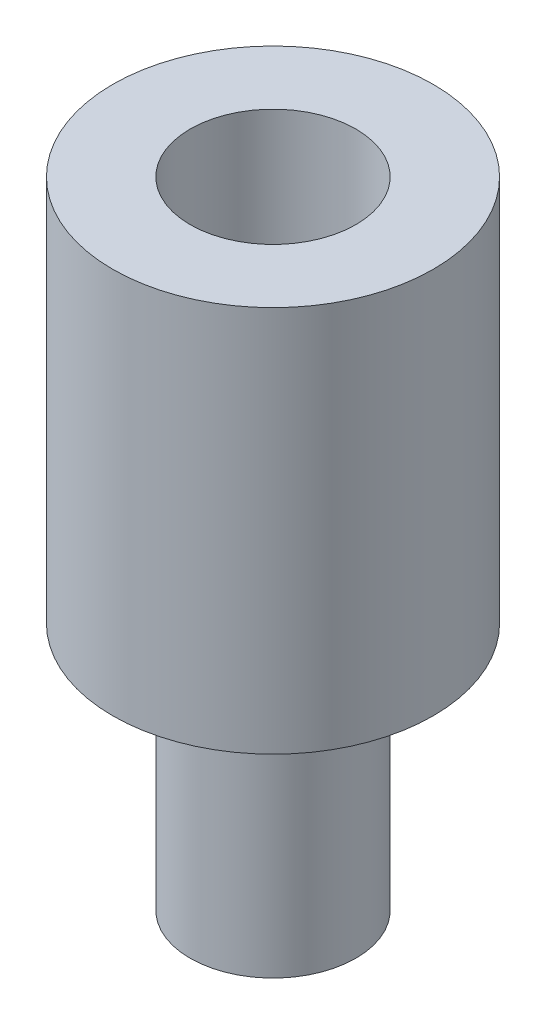
ISO-10303-21;
HEADER;
FILE_DESCRIPTION(('STEP AP214'),'2;1');
FILE_NAME('part.step','',(''),(''),'','','');
FILE_SCHEMA(('AUTOMOTIVE_DESIGN { 1 0 10303 214 1 1 1 1 }'));
ENDSEC;
DATA;
#1=APPLICATION_CONTEXT('core data for automotive mechanical design processes');
#2=APPLICATION_PROTOCOL_DEFINITION('international standard','automotive_design',2000,#1);
#3=PRODUCT_CONTEXT('',#1,'mechanical');
#4=PRODUCT('Part','Part','',(#3));
#5=PRODUCT_RELATED_PRODUCT_CATEGORY('part','',(#4));
#6=PRODUCT_DEFINITION_FORMATION('','',#4);
#7=PRODUCT_DEFINITION_CONTEXT('part definition',#1,'design');
#8=PRODUCT_DEFINITION('design','',#6,#7);
#9=PRODUCT_DEFINITION_SHAPE('','',#8);
#10=(LENGTH_UNIT() NAMED_UNIT(*) SI_UNIT(.MILLI.,.METRE.));
#11=(NAMED_UNIT(*) PLANE_ANGLE_UNIT() SI_UNIT($,.RADIAN.));
#12=(NAMED_UNIT(*) SI_UNIT($,.STERADIAN.) SOLID_ANGLE_UNIT());
#13=UNCERTAINTY_MEASURE_WITH_UNIT(LENGTH_MEASURE(1.E-05),#10,'distance_accuracy_value','');
#14=(GEOMETRIC_REPRESENTATION_CONTEXT(3) GLOBAL_UNCERTAINTY_ASSIGNED_CONTEXT((#13)) GLOBAL_UNIT_ASSIGNED_CONTEXT((#10,
#11,#12)) REPRESENTATION_CONTEXT('',''));
#15=CARTESIAN_POINT('',(0.,0.,0.));
#16=DIRECTION('',(0.,0.,1.));
#17=DIRECTION('',(1.,0.,0.));
#18=AXIS2_PLACEMENT_3D('',#15,#16,#17);
#19=CARTESIAN_POINT('',(0.,7.,0.));
#20=DIRECTION('',(0.,-1.,0.));
#21=DIRECTION('',(0.,0.,-1.));
#22=AXIS2_PLACEMENT_3D('',#19,#20,#21);
#23=CYLINDRICAL_SURFACE('',#22,2.9);
#24=CARTESIAN_POINT('',(0.,7.,0.));
#25=DIRECTION('',(0.,1.,0.));
#26=DIRECTION('',(0.,0.,1.));
#27=AXIS2_PLACEMENT_3D('',#24,#25,#26);
#28=CIRCLE('',#27,2.9);
#29=CARTESIAN_POINT('',(0.,7.,2.9));
#30=VERTEX_POINT('',#29);
#31=EDGE_CURVE('E40',#30,#30,#28,.T.);
#32=ORIENTED_EDGE('',*,*,#31,.F.);
#33=EDGE_LOOP('',(#32));
#34=FACE_BOUND('',#33,.T.);
#35=CARTESIAN_POINT('',(0.,0.,0.));
#36=DIRECTION('',(0.,1.,0.));
#37=DIRECTION('',(0.,0.,1.));
#38=AXIS2_PLACEMENT_3D('',#35,#36,#37);
#39=CIRCLE('',#38,2.9);
#40=CARTESIAN_POINT('',(0.,0.,2.9));
#41=VERTEX_POINT('',#40);
#42=EDGE_CURVE('E36',#41,#41,#39,.T.);
#43=ORIENTED_EDGE('',*,*,#42,.T.);
#44=EDGE_LOOP('',(#43));
#45=FACE_BOUND('',#44,.T.);
#46=ADVANCED_FACE('F33',(#34,#45),#23,.T.);
#47=CARTESIAN_POINT('',(0.,7.,0.));
#48=DIRECTION('',(0.,1.,0.));
#49=DIRECTION('',(0.,0.,1.));
#50=AXIS2_PLACEMENT_3D('',#47,#48,#49);
#51=PLANE('',#50);
#52=CARTESIAN_POINT('',(0.,7.,0.));
#53=DIRECTION('',(0.,1.,0.));
#54=DIRECTION('',(0.,0.,1.));
#55=AXIS2_PLACEMENT_3D('',#52,#53,#54);
#56=CIRCLE('',#55,1.5);
#57=CARTESIAN_POINT('',(0.,7.,1.5));
#58=VERTEX_POINT('',#57);
#59=EDGE_CURVE('E50',#58,#58,#56,.T.);
#60=ORIENTED_EDGE('',*,*,#59,.F.);
#61=EDGE_LOOP('',(#60));
#62=FACE_BOUND('',#61,.T.);
#63=ORIENTED_EDGE('',*,*,#31,.T.);
#64=EDGE_LOOP('',(#63));
#65=FACE_BOUND('',#64,.T.);
#66=ADVANCED_FACE('F65',(#62,#65),#51,.T.);
#67=CARTESIAN_POINT('',(0.,0.,0.));
#68=DIRECTION('',(0.,1.,0.));
#69=DIRECTION('',(0.,0.,1.));
#70=AXIS2_PLACEMENT_3D('',#67,#68,#69);
#71=PLANE('',#70);
#72=CARTESIAN_POINT('',(0.,0.,0.));
#73=DIRECTION('',(0.,-1.,0.));
#74=DIRECTION('',(0.,0.,-1.));
#75=AXIS2_PLACEMENT_3D('',#72,#73,#74);
#76=CIRCLE('',#75,1.5);
#77=CARTESIAN_POINT('',(0.,0.,-1.5));
#78=VERTEX_POINT('',#77);
#79=EDGE_CURVE('E10',#78,#78,#76,.T.);
#80=ORIENTED_EDGE('',*,*,#79,.F.);
#81=EDGE_LOOP('',(#80));
#82=FACE_BOUND('',#81,.T.);
#83=ORIENTED_EDGE('',*,*,#42,.F.);
#84=EDGE_LOOP('',(#83));
#85=FACE_BOUND('',#84,.T.);
#86=ADVANCED_FACE('F68',(#82,#85),#71,.F.);
#87=CARTESIAN_POINT('',(0.,-4.5,0.));
#88=DIRECTION('',(0.,1.,0.));
#89=DIRECTION('',(0.,0.,1.));
#90=AXIS2_PLACEMENT_3D('',#87,#88,#89);
#91=CYLINDRICAL_SURFACE('',#90,1.5);
#92=CARTESIAN_POINT('',(0.,-4.5,0.));
#93=DIRECTION('',(0.,-1.,0.));
#94=DIRECTION('',(0.,0.,-1.));
#95=AXIS2_PLACEMENT_3D('',#92,#93,#94);
#96=CIRCLE('',#95,1.5);
#97=CARTESIAN_POINT('',(0.,-4.5,-1.5));
#98=VERTEX_POINT('',#97);
#99=EDGE_CURVE('E46',#98,#98,#96,.T.);
#100=ORIENTED_EDGE('',*,*,#99,.F.);
#101=EDGE_LOOP('',(#100));
#102=FACE_BOUND('',#101,.T.);
#103=ORIENTED_EDGE('',*,*,#79,.T.);
#104=EDGE_LOOP('',(#103));
#105=FACE_BOUND('',#104,.T.);
#106=ADVANCED_FACE('F78',(#102,#105),#91,.T.);
#107=CARTESIAN_POINT('',(0.,-4.5,0.));
#108=DIRECTION('',(0.,-1.,0.));
#109=DIRECTION('',(0.,0.,-1.));
#110=AXIS2_PLACEMENT_3D('',#107,#108,#109);
#111=PLANE('',#110);
#112=ORIENTED_EDGE('',*,*,#99,.T.);
#113=EDGE_LOOP('',(#112));
#114=FACE_BOUND('',#113,.T.);
#115=ADVANCED_FACE('F61',(#114),#111,.T.);
#116=CARTESIAN_POINT('',(0.,2.5,0.));
#117=DIRECTION('',(0.,1.,0.));
#118=DIRECTION('',(0.,0.,1.));
#119=AXIS2_PLACEMENT_3D('',#116,#117,#118);
#120=CYLINDRICAL_SURFACE('',#119,1.5);
#121=CARTESIAN_POINT('',(0.,2.5,0.));
#122=DIRECTION('',(0.,1.,0.));
#123=DIRECTION('',(0.,0.,1.));
#124=AXIS2_PLACEMENT_3D('',#121,#122,#123);
#125=CIRCLE('',#124,1.5);
#126=CARTESIAN_POINT('',(0.,2.5,1.5));
#127=VERTEX_POINT('',#126);
#128=EDGE_CURVE('E49',#127,#127,#125,.T.);
#129=ORIENTED_EDGE('',*,*,#128,.F.);
#130=EDGE_LOOP('',(#129));
#131=FACE_BOUND('',#130,.T.);
#132=ORIENTED_EDGE('',*,*,#59,.T.);
#133=EDGE_LOOP('',(#132));
#134=FACE_BOUND('',#133,.T.);
#135=ADVANCED_FACE('F58',(#131,#134),#120,.F.);
#136=CARTESIAN_POINT('',(0.,2.5,0.));
#137=DIRECTION('',(0.,1.,0.));
#138=DIRECTION('',(0.,0.,1.));
#139=AXIS2_PLACEMENT_3D('',#136,#137,#138);
#140=PLANE('',#139);
#141=ORIENTED_EDGE('',*,*,#128,.T.);
#142=EDGE_LOOP('',(#141));
#143=FACE_BOUND('',#142,.T.);
#144=ADVANCED_FACE('F56',(#143),#140,.T.);
#145=CLOSED_SHELL('',(#46,#66,#86,#106,#115,#135,#144));
#146=MANIFOLD_SOLID_BREP('B2',#145);
#147=ADVANCED_BREP_SHAPE_REPRESENTATION('',(#18,#146),#14);
#148=SHAPE_DEFINITION_REPRESENTATION(#9,#147);
ENDSEC;
END-ISO-10303-21;
